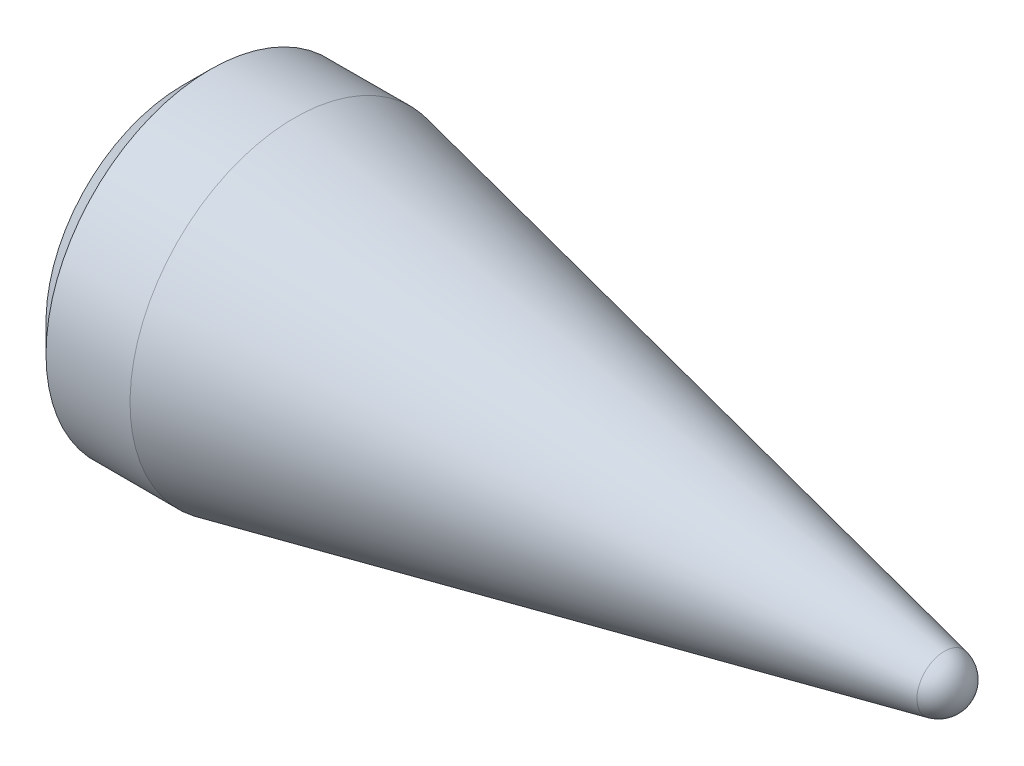
ISO-10303-21;
HEADER;
FILE_DESCRIPTION(('STEP AP214'),'2;1');
FILE_NAME('part.step','',(''),(''),'','','');
FILE_SCHEMA(('AUTOMOTIVE_DESIGN { 1 0 10303 214 1 1 1 1 }'));
ENDSEC;
DATA;
#1=APPLICATION_CONTEXT('core data for automotive mechanical design processes');
#2=APPLICATION_PROTOCOL_DEFINITION('international standard','automotive_design',2000,#1);
#3=PRODUCT_CONTEXT('',#1,'mechanical');
#4=PRODUCT('Part','Part','',(#3));
#5=PRODUCT_RELATED_PRODUCT_CATEGORY('part','',(#4));
#6=PRODUCT_DEFINITION_FORMATION('','',#4);
#7=PRODUCT_DEFINITION_CONTEXT('part definition',#1,'design');
#8=PRODUCT_DEFINITION('design','',#6,#7);
#9=PRODUCT_DEFINITION_SHAPE('','',#8);
#10=(LENGTH_UNIT() NAMED_UNIT(*) SI_UNIT(.MILLI.,.METRE.));
#11=(NAMED_UNIT(*) PLANE_ANGLE_UNIT() SI_UNIT($,.RADIAN.));
#12=(NAMED_UNIT(*) SI_UNIT($,.STERADIAN.) SOLID_ANGLE_UNIT());
#13=UNCERTAINTY_MEASURE_WITH_UNIT(LENGTH_MEASURE(1.E-05),#10,'distance_accuracy_value','');
#14=(GEOMETRIC_REPRESENTATION_CONTEXT(3) GLOBAL_UNCERTAINTY_ASSIGNED_CONTEXT((#13)) GLOBAL_UNIT_ASSIGNED_CONTEXT((#10,
#11,#12)) REPRESENTATION_CONTEXT('',''));
#15=CARTESIAN_POINT('',(0.,0.,0.));
#16=DIRECTION('',(0.,0.,1.));
#17=DIRECTION('',(1.,0.,0.));
#18=AXIS2_PLACEMENT_3D('',#15,#16,#17);
#19=CARTESIAN_POINT('',(-40.9033583867532,0.,0.));
#20=DIRECTION('',(-1.,0.,0.));
#21=DIRECTION('',(0.,-1.,0.));
#22=AXIS2_PLACEMENT_3D('',#19,#20,#21);
#23=CYLINDRICAL_SURFACE('',#22,18.6494984516856);
#24=CARTESIAN_POINT('',(-37.7283583867531,0.,0.));
#25=DIRECTION('',(1.,0.,0.));
#26=DIRECTION('',(0.,1.,0.));
#27=AXIS2_PLACEMENT_3D('',#24,#25,#26);
#28=CIRCLE('',#27,18.6494984516856);
#29=CARTESIAN_POINT('',(-37.7283583867531,18.6494984516856,0.));
#30=VERTEX_POINT('',#29);
#31=EDGE_CURVE('E10',#30,#30,#28,.T.);
#32=ORIENTED_EDGE('',*,*,#31,.T.);
#33=EDGE_LOOP('',(#32));
#34=FACE_BOUND('',#33,.T.);
#35=CARTESIAN_POINT('',(-28.2033583867532,0.,0.));
#36=DIRECTION('',(-1.,0.,0.));
#37=DIRECTION('',(0.,-1.,0.));
#38=AXIS2_PLACEMENT_3D('',#35,#36,#37);
#39=CIRCLE('',#38,18.6494984516856);
#40=CARTESIAN_POINT('',(-28.2033583867532,-18.6494984516856,0.));
#41=VERTEX_POINT('',#40);
#42=EDGE_CURVE('E44',#41,#41,#39,.T.);
#43=ORIENTED_EDGE('',*,*,#42,.T.);
#44=EDGE_LOOP('',(#43));
#45=FACE_BOUND('',#44,.T.);
#46=ADVANCED_FACE('F33',(#34,#45),#23,.T.);
#47=CARTESIAN_POINT('',(45.4769852056036,0.,0.));
#48=DIRECTION('',(-1.,0.,0.));
#49=DIRECTION('',(0.,-1.,0.));
#50=AXIS2_PLACEMENT_3D('',#47,#48,#49);
#51=CONICAL_SURFACE('',#50,3.10662997087793,0.207901894682132);
#52=CARTESIAN_POINT('',(45.4769852056036,0.,0.));
#53=DIRECTION('',(-1.,0.,0.));
#54=DIRECTION('',(0.,-1.,0.));
#55=AXIS2_PLACEMENT_3D('',#52,#53,#54);
#56=CIRCLE('',#55,3.10662997087793);
#57=CARTESIAN_POINT('',(45.4769852056036,-3.10662997087793,0.));
#58=VERTEX_POINT('',#57);
#59=EDGE_CURVE('E48',#58,#58,#56,.T.);
#60=CARTESIAN_POINT('',(-28.2033583867532,-18.6494984516856,0.));
#61=CARTESIAN_POINT('',(-27.4358548076661,-18.4875935716772,0.));
#62=CARTESIAN_POINT('',(-26.6683512285791,-18.3256886916687,0.));
#63=CARTESIAN_POINT('',(-25.133344070405,-18.0018789316519,0.));
#64=CARTESIAN_POINT('',(-24.3658404913179,-17.8399740516435,0.));
#65=CARTESIAN_POINT('',(-22.8308333331438,-17.5161642916267,0.));
#66=CARTESIAN_POINT('',(-22.0633297540568,-17.3542594116183,0.));
#67=CARTESIAN_POINT('',(-20.5283225958827,-17.0304496516014,0.));
#68=CARTESIAN_POINT('',(-19.7608190167956,-16.868544771593,0.));
#69=CARTESIAN_POINT('',(-18.2258118586215,-16.5447350115762,0.));
#70=CARTESIAN_POINT('',(-17.4583082795345,-16.3828301315678,0.));
#71=CARTESIAN_POINT('',(-15.9233011213604,-16.059020371551,0.));
#72=CARTESIAN_POINT('',(-15.1557975422733,-15.8971154915426,0.));
#73=CARTESIAN_POINT('',(-13.6207903840992,-15.5733057315257,0.));
#74=CARTESIAN_POINT('',(-12.8532868050122,-15.4114008515173,0.));
#75=CARTESIAN_POINT('',(-11.3182796468381,-15.0875910915005,0.));
#76=CARTESIAN_POINT('',(-10.550776067751,-14.9256862114921,0.));
#77=CARTESIAN_POINT('',(-9.01576890957694,-14.6018764514753,0.));
#78=CARTESIAN_POINT('',(-8.24826533048989,-14.4399715714668,0.));
#79=CARTESIAN_POINT('',(-6.71325817231579,-14.11616181145,0.));
#80=CARTESIAN_POINT('',(-5.94575459322874,-13.9542569314416,0.));
#81=CARTESIAN_POINT('',(-4.41074743505464,-13.6304471714248,0.));
#82=CARTESIAN_POINT('',(-3.6432438559676,-13.4685422914164,0.));
#83=CARTESIAN_POINT('',(-2.1082366977935,-13.1447325313995,0.));
#84=CARTESIAN_POINT('',(-1.34073311870645,-12.9828276513911,0.));
#85=CARTESIAN_POINT('',(0.19427403946765,-12.6590178913743,0.));
#86=CARTESIAN_POINT('',(0.9617776185547,-12.4971130113659,0.));
#87=CARTESIAN_POINT('',(2.4967847767288,-12.1733032513491,0.));
#88=CARTESIAN_POINT('',(3.26428835581585,-12.0113983713406,0.));
#89=CARTESIAN_POINT('',(4.79929551398995,-11.6875886113238,0.));
#90=CARTESIAN_POINT('',(5.566799093077,-11.5256837313154,0.));
#91=CARTESIAN_POINT('',(7.1018062512511,-11.2018739712986,0.));
#92=CARTESIAN_POINT('',(7.86930983033815,-11.0399690912902,0.));
#93=CARTESIAN_POINT('',(9.40431698851225,-10.7161593312733,0.));
#94=CARTESIAN_POINT('',(10.1718205675993,-10.5542544512649,0.));
#95=CARTESIAN_POINT('',(11.7068277257734,-10.2304446912481,0.));
#96=CARTESIAN_POINT('',(12.4743313048604,-10.0685398112397,0.));
#97=CARTESIAN_POINT('',(14.0093384630345,-9.74473005122286,0.));
#98=CARTESIAN_POINT('',(14.7768420421216,-9.58282517121445,0.));
#99=CARTESIAN_POINT('',(16.3118492002957,-9.25901541119762,0.));
#100=CARTESIAN_POINT('',(17.0793527793827,-9.09711053118921,0.));
#101=CARTESIAN_POINT('',(18.6143599375568,-8.77330077117238,0.));
#102=CARTESIAN_POINT('',(19.3818635166439,-8.61139589116397,0.));
#103=CARTESIAN_POINT('',(20.916870674818,-8.28758613114715,0.));
#104=CARTESIAN_POINT('',(21.684374253905,-8.12568125113873,0.));
#105=CARTESIAN_POINT('',(23.2193814120791,-7.80187149112191,0.));
#106=CARTESIAN_POINT('',(23.9868849911662,-7.63996661111349,0.));
#107=CARTESIAN_POINT('',(25.5218921493403,-7.31615685109667,0.));
#108=CARTESIAN_POINT('',(26.2893957284273,-7.15425197108825,0.));
#109=CARTESIAN_POINT('',(27.8244028866014,-6.83044221107143,0.));
#110=CARTESIAN_POINT('',(28.5919064656885,-6.66853733106302,0.));
#111=CARTESIAN_POINT('',(30.1269136238626,-6.34472757104619,0.));
#112=CARTESIAN_POINT('',(30.8944172029496,-6.18282269103778,0.));
#113=CARTESIAN_POINT('',(32.4294243611237,-5.85901293102095,0.));
#114=CARTESIAN_POINT('',(33.1969279402108,-5.69710805101254,0.));
#115=CARTESIAN_POINT('',(34.7319350983849,-5.37329829099571,0.));
#116=CARTESIAN_POINT('',(35.4994386774719,-5.2113934109873,0.));
#117=CARTESIAN_POINT('',(37.034445835646,-4.88758365097047,0.));
#118=CARTESIAN_POINT('',(37.8019494147331,-4.72567877096206,0.));
#119=CARTESIAN_POINT('',(39.3369565729072,-4.40186901094524,0.));
#120=CARTESIAN_POINT('',(40.1044601519942,-4.23996413093682,0.));
#121=CARTESIAN_POINT('',(41.6394673101683,-3.91615437092,0.));
#122=CARTESIAN_POINT('',(42.4069708892554,-3.75424949091158,0.));
#123=CARTESIAN_POINT('',(43.9419780474295,-3.43043973089476,0.));
#124=CARTESIAN_POINT('',(44.7094816265165,-3.26853485088634,0.));
#125=CARTESIAN_POINT('',(45.4769852056036,-3.10662997087793,0.));
#126=B_SPLINE_CURVE_WITH_KNOTS('',3,(#60,#61,#62,#63,#64,#65,#66,#67,#68,#69,#70,#71,#72,#73,
#74,#75,#76,#77,#78,#79,#80,#81,#82,#83,#84,#85,#86,#87,#88,#89,#90,#91,#92,#93,#94,#95,#96,#97,
#98,#99,#100,#101,#102,#103,#104,#105,#106,#107,#108,#109,#110,#111,#112,#113,#114,#115,#116,
#117,#118,#119,#120,#121,#122,#123,#124,#125),.UNSPECIFIED.,.F.,.F.,(4,2,2,2,2,2,2,2,2,2,2,2,2,
2,2,2,2,2,2,2,2,2,2,2,2,2,2,2,2,2,2,2,4),(0.,2.35318388714901,4.70636777429802,7.05955166144703,
9.41273554859604,11.7659194357451,14.1191033228941,16.4722872100431,18.8254710971921,
21.1786549843411,23.5318388714901,25.8850227586391,28.2382066457881,30.5913905329371,
32.9445744200861,35.2977583072351,37.6509421943841,40.0041260815331,42.3573099686822,
44.7104938558312,47.0636777429802,49.4168616301292,51.7700455172782,54.1232294044272,
56.4764132915762,58.8295971787252,61.1827810658742,63.5359649530232,65.8891488401722,
68.2423327273212,70.5955166144703,72.9487005016193,75.3018843887683),.UNSPECIFIED.);
#127=EDGE_CURVE('BSEAM54',#41,#58,#126,.T.);
#128=ORIENTED_EDGE('',*,*,#42,.F.);
#129=ORIENTED_EDGE('',*,*,#59,.T.);
#130=ORIENTED_EDGE('',*,*,#127,.T.);
#131=ORIENTED_EDGE('',*,*,#127,.F.);
#132=EDGE_LOOP('',(#128,#130,#129,#131));
#133=FACE_BOUND('',#132,.T.);
#134=ADVANCED_FACE('F54',(#133),#51,.T.);
#135=CARTESIAN_POINT('',(44.8216416132469,0.,0.));
#136=DIRECTION('',(-1.,0.,0.));
#137=DIRECTION('',(0.,1.,0.));
#138=AXIS2_PLACEMENT_3D('',#135,#136,#137);
#139=SPHERICAL_SURFACE('',#138,3.175);
#140=ORIENTED_EDGE('',*,*,#59,.F.);
#141=EDGE_LOOP('',(#140));
#142=FACE_BOUND('',#141,.T.);
#143=ADVANCED_FACE('F56',(#142),#139,.T.);
#144=CARTESIAN_POINT('',(-40.9033583867532,18.6494984516856,0.));
#145=DIRECTION('',(1.,0.,0.));
#146=DIRECTION('',(0.,1.,0.));
#147=AXIS2_PLACEMENT_3D('',#144,#145,#146);
#148=PLANE('',#147);
#149=CARTESIAN_POINT('',(-40.9033583867532,0.,0.));
#150=DIRECTION('',(1.,0.,0.));
#151=DIRECTION('',(0.,1.,0.));
#152=AXIS2_PLACEMENT_3D('',#149,#150,#151);
#153=CIRCLE('',#152,15.4744984516856);
#154=CARTESIAN_POINT('',(-40.9033583867532,15.4744984516856,0.));
#155=VERTEX_POINT('',#154);
#156=EDGE_CURVE('E40',#155,#155,#153,.F.);
#157=ORIENTED_EDGE('',*,*,#156,.T.);
#158=EDGE_LOOP('',(#157));
#159=FACE_BOUND('',#158,.T.);
#160=ADVANCED_FACE('F58',(#159),#148,.F.);
#161=CARTESIAN_POINT('',(-40.9033583867532,0.,0.));
#162=DIRECTION('',(1.,0.,0.));
#163=DIRECTION('',(0.,1.,0.));
#164=AXIS2_PLACEMENT_3D('',#161,#162,#163);
#165=CONICAL_SURFACE('',#164,15.4744984516856,0.785398163397447);
#166=ORIENTED_EDGE('',*,*,#31,.F.);
#167=EDGE_LOOP('',(#166));
#168=FACE_BOUND('',#167,.T.);
#169=ORIENTED_EDGE('',*,*,#156,.F.);
#170=EDGE_LOOP('',(#169));
#171=FACE_BOUND('',#170,.T.);
#172=ADVANCED_FACE('F35',(#168,#171),#165,.T.);
#173=CLOSED_SHELL('',(#46,#134,#143,#160,#172));
#174=MANIFOLD_SOLID_BREP('B2',#173);
#175=ADVANCED_BREP_SHAPE_REPRESENTATION('',(#18,#174),#14);
#176=SHAPE_DEFINITION_REPRESENTATION(#9,#175);
ENDSEC;
END-ISO-10303-21;
